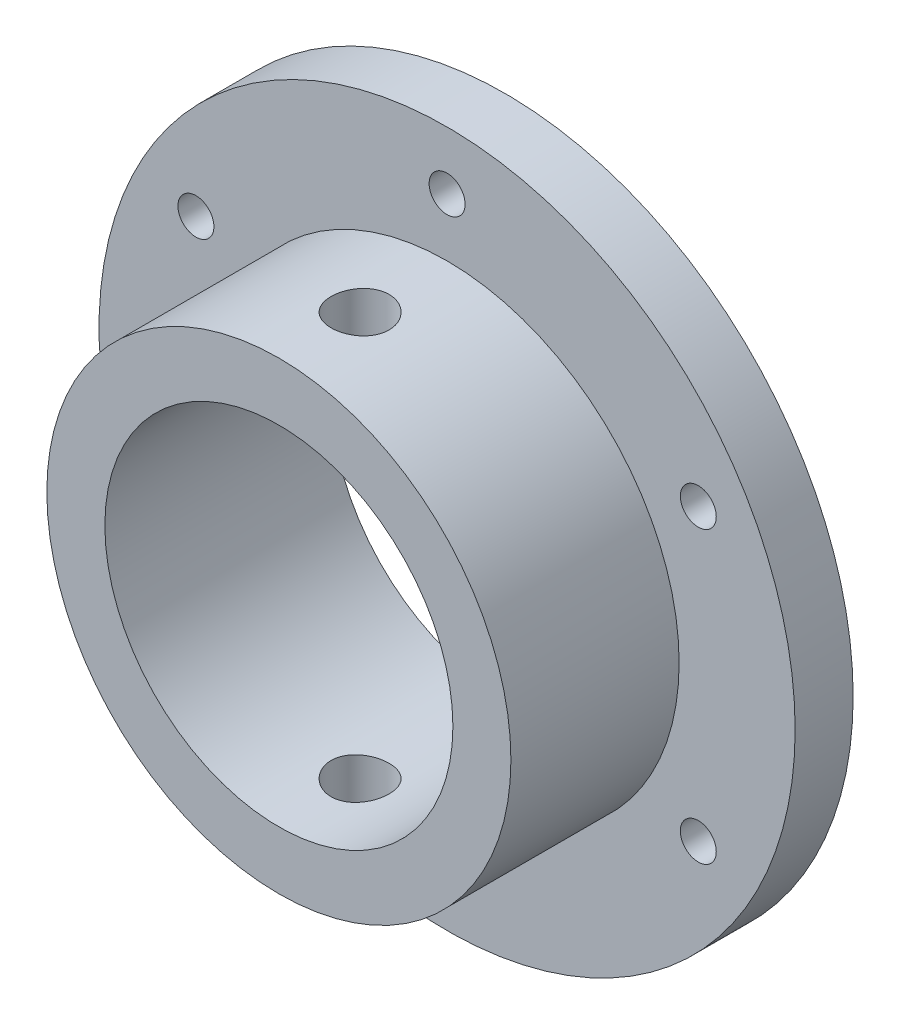
ISO-10303-21;
HEADER;
FILE_DESCRIPTION(('STEP AP214'),'2;1');
FILE_NAME('part.step','',(''),(''),'','','');
FILE_SCHEMA(('AUTOMOTIVE_DESIGN { 1 0 10303 214 1 1 1 1 }'));
ENDSEC;
DATA;
#1=APPLICATION_CONTEXT('core data for automotive mechanical design processes');
#2=APPLICATION_PROTOCOL_DEFINITION('international standard','automotive_design',2000,#1);
#3=PRODUCT_CONTEXT('',#1,'mechanical');
#4=PRODUCT('Part','Part','',(#3));
#5=PRODUCT_RELATED_PRODUCT_CATEGORY('part','',(#4));
#6=PRODUCT_DEFINITION_FORMATION('','',#4);
#7=PRODUCT_DEFINITION_CONTEXT('part definition',#1,'design');
#8=PRODUCT_DEFINITION('design','',#6,#7);
#9=PRODUCT_DEFINITION_SHAPE('','',#8);
#10=(LENGTH_UNIT() NAMED_UNIT(*) SI_UNIT(.MILLI.,.METRE.));
#11=(NAMED_UNIT(*) PLANE_ANGLE_UNIT() SI_UNIT($,.RADIAN.));
#12=(NAMED_UNIT(*) SI_UNIT($,.STERADIAN.) SOLID_ANGLE_UNIT());
#13=UNCERTAINTY_MEASURE_WITH_UNIT(LENGTH_MEASURE(1.E-05),#10,'distance_accuracy_value','');
#14=(GEOMETRIC_REPRESENTATION_CONTEXT(3) GLOBAL_UNCERTAINTY_ASSIGNED_CONTEXT((#13)) GLOBAL_UNIT_ASSIGNED_CONTEXT((#10,
#11,#12)) REPRESENTATION_CONTEXT('',''));
#15=CARTESIAN_POINT('',(0.,0.,0.));
#16=DIRECTION('',(0.,0.,1.));
#17=DIRECTION('',(1.,0.,0.));
#18=AXIS2_PLACEMENT_3D('',#15,#16,#17);
#19=CARTESIAN_POINT('',(0.,0.,5.));
#20=DIRECTION('',(0.,0.,-1.));
#21=DIRECTION('',(-1.,0.,0.));
#22=AXIS2_PLACEMENT_3D('',#19,#20,#21);
#23=CYLINDRICAL_SURFACE('',#22,30.);
#24=CARTESIAN_POINT('',(0.,0.,5.));
#25=DIRECTION('',(0.,0.,1.));
#26=DIRECTION('',(1.,0.,0.));
#27=AXIS2_PLACEMENT_3D('',#24,#25,#26);
#28=CIRCLE('',#27,30.);
#29=CARTESIAN_POINT('',(30.,0.,5.));
#30=VERTEX_POINT('',#29);
#31=EDGE_CURVE('E10',#30,#30,#28,.T.);
#32=ORIENTED_EDGE('',*,*,#31,.F.);
#33=EDGE_LOOP('',(#32));
#34=FACE_BOUND('',#33,.T.);
#35=CARTESIAN_POINT('',(0.,0.,0.));
#36=DIRECTION('',(0.,0.,1.));
#37=DIRECTION('',(1.,0.,0.));
#38=AXIS2_PLACEMENT_3D('',#35,#36,#37);
#39=CIRCLE('',#38,30.);
#40=CARTESIAN_POINT('',(30.,0.,0.));
#41=VERTEX_POINT('',#40);
#42=EDGE_CURVE('E38',#41,#41,#39,.T.);
#43=ORIENTED_EDGE('',*,*,#42,.T.);
#44=EDGE_LOOP('',(#43));
#45=FACE_BOUND('',#44,.T.);
#46=ADVANCED_FACE('F31',(#34,#45),#23,.T.);
#47=CARTESIAN_POINT('',(0.,0.,5.));
#48=DIRECTION('',(0.,0.,1.));
#49=DIRECTION('',(1.,0.,0.));
#50=AXIS2_PLACEMENT_3D('',#47,#48,#49);
#51=PLANE('',#50);
#52=CARTESIAN_POINT('',(0.,25.,5.));
#53=DIRECTION('',(0.,0.,1.));
#54=DIRECTION('',(1.,0.,0.));
#55=AXIS2_PLACEMENT_3D('',#52,#53,#54);
#56=CIRCLE('',#55,1.55);
#57=CARTESIAN_POINT('',(1.55,25.,5.));
#58=VERTEX_POINT('',#57);
#59=EDGE_CURVE('E200',#58,#58,#56,.T.);
#60=ORIENTED_EDGE('',*,*,#59,.F.);
#61=EDGE_LOOP('',(#60));
#62=FACE_BOUND('',#61,.T.);
#63=CARTESIAN_POINT('',(-21.6506350946103,12.4999999999988,5.));
#64=DIRECTION('',(0.,0.,1.));
#65=DIRECTION('',(1.,0.,0.));
#66=AXIS2_PLACEMENT_3D('',#63,#64,#65);
#67=CIRCLE('',#66,1.55);
#68=CARTESIAN_POINT('',(-20.1006350946103,12.4999999999988,5.));
#69=VERTEX_POINT('',#68);
#70=EDGE_CURVE('E224',#69,#69,#67,.T.);
#71=ORIENTED_EDGE('',*,*,#70,.F.);
#72=EDGE_LOOP('',(#71));
#73=FACE_BOUND('',#72,.T.);
#74=CARTESIAN_POINT('',(-21.6506350946088,-12.5000000000012,5.));
#75=DIRECTION('',(0.,0.,1.));
#76=DIRECTION('',(1.,0.,0.));
#77=AXIS2_PLACEMENT_3D('',#74,#75,#76);
#78=CIRCLE('',#77,1.55);
#79=CARTESIAN_POINT('',(-20.1006350946088,-12.5000000000012,5.));
#80=VERTEX_POINT('',#79);
#81=EDGE_CURVE('E91',#80,#80,#78,.T.);
#82=ORIENTED_EDGE('',*,*,#81,.F.);
#83=EDGE_LOOP('',(#82));
#84=FACE_BOUND('',#83,.T.);
#85=CARTESIAN_POINT('',(2.8329860920468E-12,-25.,5.));
#86=DIRECTION('',(0.,0.,1.));
#87=DIRECTION('',(1.,0.,0.));
#88=AXIS2_PLACEMENT_3D('',#85,#86,#87);
#89=CIRCLE('',#88,1.55);
#90=CARTESIAN_POINT('',(1.55000000000283,-25.,5.));
#91=VERTEX_POINT('',#90);
#92=EDGE_CURVE('E228',#91,#91,#89,.T.);
#93=ORIENTED_EDGE('',*,*,#92,.F.);
#94=EDGE_LOOP('',(#93));
#95=FACE_BOUND('',#94,.T.);
#96=CARTESIAN_POINT('',(21.6506350946131,-12.4999999999988,5.));
#97=DIRECTION('',(0.,0.,1.));
#98=DIRECTION('',(1.,0.,0.));
#99=AXIS2_PLACEMENT_3D('',#96,#97,#98);
#100=CIRCLE('',#99,1.55);
#101=CARTESIAN_POINT('',(23.2006350946131,-12.4999999999988,5.));
#102=VERTEX_POINT('',#101);
#103=EDGE_CURVE('E221',#102,#102,#100,.T.);
#104=ORIENTED_EDGE('',*,*,#103,.F.);
#105=EDGE_LOOP('',(#104));
#106=FACE_BOUND('',#105,.T.);
#107=CARTESIAN_POINT('',(21.6506350946117,12.5000000000012,5.));
#108=DIRECTION('',(0.,0.,1.));
#109=DIRECTION('',(1.,0.,0.));
#110=AXIS2_PLACEMENT_3D('',#107,#108,#109);
#111=CIRCLE('',#110,1.55);
#112=CARTESIAN_POINT('',(23.2006350946117,12.5000000000012,5.));
#113=VERTEX_POINT('',#112);
#114=EDGE_CURVE('E218',#113,#113,#111,.T.);
#115=ORIENTED_EDGE('',*,*,#114,.F.);
#116=EDGE_LOOP('',(#115));
#117=FACE_BOUND('',#116,.T.);
#118=CARTESIAN_POINT('',(0.,0.,5.));
#119=DIRECTION('',(0.,0.,1.));
#120=DIRECTION('',(1.,0.,0.));
#121=AXIS2_PLACEMENT_3D('',#118,#119,#120);
#122=CIRCLE('',#121,20.);
#123=CARTESIAN_POINT('',(20.,0.,5.));
#124=VERTEX_POINT('',#123);
#125=EDGE_CURVE('E46',#124,#124,#122,.T.);
#126=ORIENTED_EDGE('',*,*,#125,.F.);
#127=EDGE_LOOP('',(#126));
#128=FACE_BOUND('',#127,.T.);
#129=ORIENTED_EDGE('',*,*,#31,.T.);
#130=EDGE_LOOP('',(#129));
#131=FACE_BOUND('',#130,.T.);
#132=ADVANCED_FACE('F103',(#62,#73,#84,#95,#106,#117,#128,#131),#51,.T.);
#133=CARTESIAN_POINT('',(0.,0.,0.));
#134=DIRECTION('',(0.,0.,1.));
#135=DIRECTION('',(1.,0.,0.));
#136=AXIS2_PLACEMENT_3D('',#133,#134,#135);
#137=PLANE('',#136);
#138=CARTESIAN_POINT('',(0.,25.,0.));
#139=DIRECTION('',(0.,0.,1.));
#140=DIRECTION('',(1.,0.,0.));
#141=AXIS2_PLACEMENT_3D('',#138,#139,#140);
#142=CIRCLE('',#141,1.55);
#143=CARTESIAN_POINT('',(1.55,25.,0.));
#144=VERTEX_POINT('',#143);
#145=EDGE_CURVE('E34',#144,#144,#142,.T.);
#146=ORIENTED_EDGE('',*,*,#145,.T.);
#147=EDGE_LOOP('',(#146));
#148=FACE_BOUND('',#147,.T.);
#149=CARTESIAN_POINT('',(-21.6506350946103,12.4999999999988,0.));
#150=DIRECTION('',(0.,0.,1.));
#151=DIRECTION('',(1.,0.,0.));
#152=AXIS2_PLACEMENT_3D('',#149,#150,#151);
#153=CIRCLE('',#152,1.55);
#154=CARTESIAN_POINT('',(-20.1006350946103,12.4999999999988,0.));
#155=VERTEX_POINT('',#154);
#156=EDGE_CURVE('E202',#155,#155,#153,.T.);
#157=ORIENTED_EDGE('',*,*,#156,.T.);
#158=EDGE_LOOP('',(#157));
#159=FACE_BOUND('',#158,.T.);
#160=CARTESIAN_POINT('',(-21.6506350946088,-12.5000000000012,0.));
#161=DIRECTION('',(0.,0.,1.));
#162=DIRECTION('',(1.,0.,0.));
#163=AXIS2_PLACEMENT_3D('',#160,#161,#162);
#164=CIRCLE('',#163,1.55);
#165=CARTESIAN_POINT('',(-20.1006350946088,-12.5000000000012,0.));
#166=VERTEX_POINT('',#165);
#167=EDGE_CURVE('E204',#166,#166,#164,.T.);
#168=ORIENTED_EDGE('',*,*,#167,.T.);
#169=EDGE_LOOP('',(#168));
#170=FACE_BOUND('',#169,.T.);
#171=CARTESIAN_POINT('',(2.8329860920468E-12,-25.,0.));
#172=DIRECTION('',(0.,0.,1.));
#173=DIRECTION('',(1.,0.,0.));
#174=AXIS2_PLACEMENT_3D('',#171,#172,#173);
#175=CIRCLE('',#174,1.55);
#176=CARTESIAN_POINT('',(1.55000000000283,-25.,0.));
#177=VERTEX_POINT('',#176);
#178=EDGE_CURVE('E207',#177,#177,#175,.T.);
#179=ORIENTED_EDGE('',*,*,#178,.T.);
#180=EDGE_LOOP('',(#179));
#181=FACE_BOUND('',#180,.T.);
#182=CARTESIAN_POINT('',(21.6506350946131,-12.4999999999988,0.));
#183=DIRECTION('',(0.,0.,1.));
#184=DIRECTION('',(1.,0.,0.));
#185=AXIS2_PLACEMENT_3D('',#182,#183,#184);
#186=CIRCLE('',#185,1.55);
#187=CARTESIAN_POINT('',(23.2006350946131,-12.4999999999988,0.));
#188=VERTEX_POINT('',#187);
#189=EDGE_CURVE('E212',#188,#188,#186,.T.);
#190=ORIENTED_EDGE('',*,*,#189,.T.);
#191=EDGE_LOOP('',(#190));
#192=FACE_BOUND('',#191,.T.);
#193=CARTESIAN_POINT('',(21.6506350946117,12.5000000000012,0.));
#194=DIRECTION('',(0.,0.,1.));
#195=DIRECTION('',(1.,0.,0.));
#196=AXIS2_PLACEMENT_3D('',#193,#194,#195);
#197=CIRCLE('',#196,1.55);
#198=CARTESIAN_POINT('',(23.2006350946117,12.5000000000012,0.));
#199=VERTEX_POINT('',#198);
#200=EDGE_CURVE('E214',#199,#199,#197,.T.);
#201=ORIENTED_EDGE('',*,*,#200,.T.);
#202=EDGE_LOOP('',(#201));
#203=FACE_BOUND('',#202,.T.);
#204=CARTESIAN_POINT('',(0.,0.,0.));
#205=DIRECTION('',(0.,0.,1.));
#206=DIRECTION('',(1.,0.,0.));
#207=AXIS2_PLACEMENT_3D('',#204,#205,#206);
#208=CIRCLE('',#207,15.);
#209=CARTESIAN_POINT('',(15.,0.,0.));
#210=VERTEX_POINT('',#209);
#211=EDGE_CURVE('E49',#210,#210,#208,.T.);
#212=ORIENTED_EDGE('',*,*,#211,.T.);
#213=EDGE_LOOP('',(#212));
#214=FACE_BOUND('',#213,.T.);
#215=ORIENTED_EDGE('',*,*,#42,.F.);
#216=EDGE_LOOP('',(#215));
#217=FACE_BOUND('',#216,.T.);
#218=ADVANCED_FACE('F106',(#148,#159,#170,#181,#192,#203,#214,#217),#137,.F.);
#219=CARTESIAN_POINT('',(0.,0.,19.5));
#220=DIRECTION('',(0.,0.,1.));
#221=DIRECTION('',(1.,0.,0.));
#222=AXIS2_PLACEMENT_3D('',#219,#220,#221);
#223=PLANE('',#222);
#224=CARTESIAN_POINT('',(0.,0.,19.5));
#225=DIRECTION('',(0.,0.,1.));
#226=DIRECTION('',(1.,0.,0.));
#227=AXIS2_PLACEMENT_3D('',#224,#225,#226);
#228=CIRCLE('',#227,20.);
#229=CARTESIAN_POINT('',(20.,0.,19.5));
#230=VERTEX_POINT('',#229);
#231=EDGE_CURVE('E43',#230,#230,#228,.T.);
#232=ORIENTED_EDGE('',*,*,#231,.T.);
#233=EDGE_LOOP('',(#232));
#234=FACE_BOUND('',#233,.T.);
#235=CARTESIAN_POINT('',(0.,0.,19.5));
#236=DIRECTION('',(0.,0.,1.));
#237=DIRECTION('',(1.,0.,0.));
#238=AXIS2_PLACEMENT_3D('',#235,#236,#237);
#239=CIRCLE('',#238,15.);
#240=CARTESIAN_POINT('',(15.,0.,19.5));
#241=VERTEX_POINT('',#240);
#242=EDGE_CURVE('E52',#241,#241,#239,.T.);
#243=ORIENTED_EDGE('',*,*,#242,.F.);
#244=EDGE_LOOP('',(#243));
#245=FACE_BOUND('',#244,.T.);
#246=ADVANCED_FACE('F101',(#234,#245),#223,.T.);
#247=CARTESIAN_POINT('',(0.,0.,19.5));
#248=DIRECTION('',(0.,0.,-1.));
#249=DIRECTION('',(-1.,0.,0.));
#250=AXIS2_PLACEMENT_3D('',#247,#248,#249);
#251=CYLINDRICAL_SURFACE('',#250,20.);
#252=CARTESIAN_POINT('',(0.,-20.,15.));
#253=CARTESIAN_POINT('',(0.139841095555761,-19.9999980489643,14.9999940590643));
#254=CARTESIAN_POINT('',(0.279769574302747,-19.998517845549,14.9882271208307));
#255=CARTESIAN_POINT('',(0.555732802089753,-19.9927554011136,14.9414722454292));
#256=CARTESIAN_POINT('',(0.691763330623745,-19.9884702344143,14.9064600620766));
#257=CARTESIAN_POINT('',(0.955895574813054,-19.9775806104441,14.8142623560859));
#258=CARTESIAN_POINT('',(1.08400256014614,-19.9709777145554,14.7570917581901));
#259=CARTESIAN_POINT('',(1.32877947489304,-19.956187008781,14.6222327160302));
#260=CARTESIAN_POINT('',(1.44545136155637,-19.9479994708412,14.5445477914693));
#261=CARTESIAN_POINT('',(1.66471281693132,-19.9309032130633,14.3704080501604));
#262=CARTESIAN_POINT('',(1.76723036493713,-19.9219911469242,14.2738628706538));
#263=CARTESIAN_POINT('',(1.95465279355749,-19.9044772600975,14.0649371764634));
#264=CARTESIAN_POINT('',(2.03955677639225,-19.8958754552427,13.9525558550868));
#265=CARTESIAN_POINT('',(2.18961016128394,-19.8799230561958,13.7146800224343));
#266=CARTESIAN_POINT('',(2.25469209594107,-19.8725767717791,13.5891426384321));
#267=CARTESIAN_POINT('',(2.36282307657512,-19.8600112845768,13.3288129480526));
#268=CARTESIAN_POINT('',(2.40587295806522,-19.8547920011314,13.194020992853));
#269=CARTESIAN_POINT('',(2.46849898002476,-19.8471033960361,12.9197558044132));
#270=CARTESIAN_POINT('',(2.4881967147317,-19.8446198343674,12.7803107422958));
#271=CARTESIAN_POINT('',(2.50393554955723,-19.8426402814279,12.5000737365282));
#272=CARTESIAN_POINT('',(2.49997760100242,-19.8431441700151,12.3592818472687));
#273=CARTESIAN_POINT('',(2.4686172364479,-19.8470695536975,12.0811951727512));
#274=CARTESIAN_POINT('',(2.4413487629847,-19.8504743796033,11.9438850137997));
#275=CARTESIAN_POINT('',(2.36435038318205,-19.8597919975763,11.675804978781));
#276=CARTESIAN_POINT('',(2.3146200217519,-19.8657048404572,11.545035235286));
#277=CARTESIAN_POINT('',(2.19396555991165,-19.8793911586465,11.2933320009783));
#278=CARTESIAN_POINT('',(2.12298325370764,-19.8871697321144,11.172426699751));
#279=CARTESIAN_POINT('',(1.96188146945692,-19.903707114306,10.9441933055868));
#280=CARTESIAN_POINT('',(1.87176111608078,-19.9124659678566,10.8368658340263));
#281=CARTESIAN_POINT('',(1.67419911075378,-19.9300510989042,10.6380572892773));
#282=CARTESIAN_POINT('',(1.56664200784001,-19.9388774238689,10.546690908234));
#283=CARTESIAN_POINT('',(1.33765716911392,-19.9555463255585,10.3832911199695));
#284=CARTESIAN_POINT('',(1.21622940131825,-19.9633889000151,10.311257757328));
#285=CARTESIAN_POINT('',(0.962861671363481,-19.9772115221858,10.1885686795361));
#286=CARTESIAN_POINT('',(0.830918195337717,-19.9831909440154,10.1379201461188));
#287=CARTESIAN_POINT('',(0.560307940431056,-19.9926078578006,10.0595295064767));
#288=CARTESIAN_POINT('',(0.421641476630667,-19.9960454687587,10.0317863278629));
#289=CARTESIAN_POINT('',(0.142513163913496,-19.9999759641076,10.0001425757394));
#290=CARTESIAN_POINT('',(0.00206949019860591,-20.0004883614264,9.99608400763593));
#291=CARTESIAN_POINT('',(-0.277496036497497,-19.9985633800543,10.0115077340559));
#292=CARTESIAN_POINT('',(-0.416617917564708,-19.9961260641821,10.0309895272516));
#293=CARTESIAN_POINT('',(-0.689124507721523,-19.9885876875669,10.0928097087744));
#294=CARTESIAN_POINT('',(-0.822526570424706,-19.9834954081387,10.1350727634026));
#295=CARTESIAN_POINT('',(-1.08034965485841,-19.971217231002,10.2411774519129));
#296=CARTESIAN_POINT('',(-1.20477037146532,-19.9640312622062,10.3050198184914));
#297=CARTESIAN_POINT('',(-1.44180452068743,-19.9483182291011,10.4528531375075));
#298=CARTESIAN_POINT('',(-1.55435375994382,-19.9397844404251,10.5369462898056));
#299=CARTESIAN_POINT('',(-1.76379698962632,-19.9223514232566,10.7227494975342));
#300=CARTESIAN_POINT('',(-1.86069035833686,-19.913452180269,10.824460252251));
#301=CARTESIAN_POINT('',(-2.03663195881802,-19.8962310546258,11.0433074167571));
#302=CARTESIAN_POINT('',(-2.11557546056793,-19.8879127472133,11.1605283463104));
#303=CARTESIAN_POINT('',(-2.25265288944351,-19.8728541103715,11.4066582448547));
#304=CARTESIAN_POINT('',(-2.31078723372837,-19.8661137493103,11.5355669794765));
#305=CARTESIAN_POINT('',(-2.40442657886654,-19.85499850393,11.8010753191476));
#306=CARTESIAN_POINT('',(-2.43999062745711,-19.8506174518479,11.937653830048));
#307=CARTESIAN_POINT('',(-2.48766999386785,-19.8446991590745,12.2149024837807));
#308=CARTESIAN_POINT('',(-2.49978640253576,-19.8431617860878,12.355572435959));
#309=CARTESIAN_POINT('',(-2.50020653608484,-19.8431087698246,12.6359689292047));
#310=CARTESIAN_POINT('',(-2.48867479769927,-19.8445722475195,12.7756952483319));
#311=CARTESIAN_POINT('',(-2.44247440484933,-19.850311145372,13.0512071293451));
#312=CARTESIAN_POINT('',(-2.40780574790577,-19.8545865658308,13.1869926908088));
#313=CARTESIAN_POINT('',(-2.31636707368966,-19.8654611577455,13.4507469567664));
#314=CARTESIAN_POINT('',(-2.25960498097093,-19.8720594959278,13.5787184450218));
#315=CARTESIAN_POINT('',(-2.12560690215031,-19.8868378324482,13.8233466540483));
#316=CARTESIAN_POINT('',(-2.04837065950959,-19.8950178506041,13.9400032330198));
#317=CARTESIAN_POINT('',(-1.87500633126584,-19.9121060475223,14.1595312253405));
#318=CARTESIAN_POINT('',(-1.77875562577496,-19.9210187208403,14.262305460955));
#319=CARTESIAN_POINT('',(-1.57035022696838,-19.938528315929,14.450306825168));
#320=CARTESIAN_POINT('',(-1.45819178914157,-19.9471251627559,14.5355298107743));
#321=CARTESIAN_POINT('',(-1.22066562085421,-19.9630705658675,14.6862853571053));
#322=CARTESIAN_POINT('',(-1.09524927959617,-19.970414250783,14.7517418058993));
#323=CARTESIAN_POINT('',(-0.835182902301279,-19.9829764907672,14.8605712429163));
#324=CARTESIAN_POINT('',(-0.700543080870235,-19.9881973536958,14.9039682263535));
#325=CARTESIAN_POINT('',(-0.471005771967924,-19.9946672032775,14.9570593381713));
#326=CARTESIAN_POINT('',(-0.37755566351692,-19.9966572589545,14.9731389419821));
#327=CARTESIAN_POINT('',(-0.189417063212434,-19.9993243132919,14.9946112456932));
#328=CARTESIAN_POINT('',(-0.0947285804960271,-20.0000013216347,15.0000040243993));
#329=CARTESIAN_POINT('',(0.,-20.,15.));
#330=B_SPLINE_CURVE_WITH_KNOTS('',3,(#252,#253,#254,#255,#256,#257,#258,#259,#260,#261,#262,
#263,#264,#265,#266,#267,#268,#269,#270,#271,#272,#273,#274,#275,#276,#277,#278,#279,#280,#281,
#282,#283,#284,#285,#286,#287,#288,#289,#290,#291,#292,#293,#294,#295,#296,#297,#298,#299,#300,
#301,#302,#303,#304,#305,#306,#307,#308,#309,#310,#311,#312,#313,#314,#315,#316,#317,#318,#319,
#320,#321,#322,#323,#324,#325,#326,#327,#328,#329),.UNSPECIFIED.,.T.,.F.,(4,2,2,2,2,2,2,2,2,2,2,
2,2,2,2,2,2,2,2,2,2,2,2,2,2,2,2,2,2,2,2,2,2,2,2,2,2,2,4),(0.,0.419177272776247,
0.838792460943427,1.25812550818177,1.67738665591073,2.09870813201843,2.52005107800011,
2.9428125031887,3.36555789496807,3.78609225286321,4.20660969884664,4.62472696441692,
5.04285270166242,5.46213426285534,5.88143500513639,6.30363478136417,6.72583553113114,
7.14817795731606,7.57050060903781,7.99000279391922,8.40949604501929,8.82761053893396,
9.24573923078948,9.66602402928422,10.0863255137509,10.5090197150757,10.9317054422154,
11.3532807428093,11.7748364301062,12.1934690120222,12.6121016387955,13.0305842470649,
13.4490720991226,13.8703523769183,14.2917319847001,14.7147140303685,15.1372349868403,
15.4211884318763,15.7051397830044),.UNSPECIFIED.);
#331=CARTESIAN_POINT('',(0.,-20.,15.));
#332=VERTEX_POINT('',#331);
#333=EDGE_CURVE('E53',#332,#332,#330,.T.);
#334=ORIENTED_EDGE('',*,*,#333,.T.);
#335=EDGE_LOOP('',(#334));
#336=FACE_BOUND('',#335,.T.);
#337=CARTESIAN_POINT('',(0.,20.,15.));
#338=CARTESIAN_POINT('',(-0.139841095555761,19.9999980489643,14.9999940590643));
#339=CARTESIAN_POINT('',(-0.279769574302747,19.998517845549,14.9882271208307));
#340=CARTESIAN_POINT('',(-0.555732802089752,19.9927554011136,14.9414722454292));
#341=CARTESIAN_POINT('',(-0.691763330623745,19.9884702344143,14.9064600620766));
#342=CARTESIAN_POINT('',(-0.955895574813054,19.9775806104441,14.8142623560859));
#343=CARTESIAN_POINT('',(-1.08400256014614,19.9709777145554,14.7570917581901));
#344=CARTESIAN_POINT('',(-1.32877947489304,19.956187008781,14.6222327160302));
#345=CARTESIAN_POINT('',(-1.44545136155637,19.9479994708412,14.5445477914693));
#346=CARTESIAN_POINT('',(-1.66471281693132,19.9309032130633,14.3704080501604));
#347=CARTESIAN_POINT('',(-1.76723036493713,19.9219911469242,14.2738628706538));
#348=CARTESIAN_POINT('',(-1.95465279355749,19.9044772600975,14.0649371764634));
#349=CARTESIAN_POINT('',(-2.03955677639225,19.8958754552427,13.9525558550868));
#350=CARTESIAN_POINT('',(-2.18961016128394,19.8799230561958,13.7146800224343));
#351=CARTESIAN_POINT('',(-2.25469209594107,19.8725767717791,13.5891426384321));
#352=CARTESIAN_POINT('',(-2.36282307657512,19.8600112845768,13.3288129480526));
#353=CARTESIAN_POINT('',(-2.40587295806522,19.8547920011314,13.194020992853));
#354=CARTESIAN_POINT('',(-2.46849898002476,19.8471033960361,12.9197558044132));
#355=CARTESIAN_POINT('',(-2.4881967147317,19.8446198343674,12.7803107422958));
#356=CARTESIAN_POINT('',(-2.50393554955723,19.8426402814279,12.5000737365282));
#357=CARTESIAN_POINT('',(-2.49997760100242,19.8431441700151,12.3592818472687));
#358=CARTESIAN_POINT('',(-2.4686172364479,19.8470695536975,12.0811951727512));
#359=CARTESIAN_POINT('',(-2.4413487629847,19.8504743796033,11.9438850137997));
#360=CARTESIAN_POINT('',(-2.36435038318205,19.8597919975763,11.675804978781));
#361=CARTESIAN_POINT('',(-2.3146200217519,19.8657048404572,11.545035235286));
#362=CARTESIAN_POINT('',(-2.19396555991165,19.8793911586465,11.2933320009783));
#363=CARTESIAN_POINT('',(-2.12298325370764,19.8871697321144,11.172426699751));
#364=CARTESIAN_POINT('',(-1.96188146945692,19.903707114306,10.9441933055868));
#365=CARTESIAN_POINT('',(-1.87176111608078,19.9124659678566,10.8368658340263));
#366=CARTESIAN_POINT('',(-1.67419911075378,19.9300510989042,10.6380572892773));
#367=CARTESIAN_POINT('',(-1.56664200784001,19.9388774238689,10.546690908234));
#368=CARTESIAN_POINT('',(-1.33765716911392,19.9555463255585,10.3832911199695));
#369=CARTESIAN_POINT('',(-1.21622940131825,19.9633889000151,10.311257757328));
#370=CARTESIAN_POINT('',(-0.96286167136348,19.9772115221858,10.1885686795361));
#371=CARTESIAN_POINT('',(-0.830918195337715,19.9831909440154,10.1379201461188));
#372=CARTESIAN_POINT('',(-0.560307940431055,19.9926078578006,10.0595295064767));
#373=CARTESIAN_POINT('',(-0.421641476630666,19.9960454687587,10.0317863278629));
#374=CARTESIAN_POINT('',(-0.142513163913496,19.9999759641076,10.0001425757394));
#375=CARTESIAN_POINT('',(-0.00206949019860588,20.0004883614264,9.99608400763593));
#376=CARTESIAN_POINT('',(0.277496036497497,19.9985633800543,10.0115077340559));
#377=CARTESIAN_POINT('',(0.416617917564708,19.9961260641821,10.0309895272516));
#378=CARTESIAN_POINT('',(0.689124507721523,19.9885876875669,10.0928097087744));
#379=CARTESIAN_POINT('',(0.822526570424706,19.9834954081387,10.1350727634026));
#380=CARTESIAN_POINT('',(1.08034965485841,19.971217231002,10.2411774519129));
#381=CARTESIAN_POINT('',(1.20477037146532,19.9640312622062,10.3050198184914));
#382=CARTESIAN_POINT('',(1.44180452068743,19.9483182291011,10.4528531375075));
#383=CARTESIAN_POINT('',(1.55435375994382,19.9397844404251,10.5369462898056));
#384=CARTESIAN_POINT('',(1.76379698962632,19.9223514232566,10.7227494975342));
#385=CARTESIAN_POINT('',(1.86069035833686,19.913452180269,10.824460252251));
#386=CARTESIAN_POINT('',(2.03663195881802,19.8962310546258,11.0433074167571));
#387=CARTESIAN_POINT('',(2.11557546056793,19.8879127472133,11.1605283463104));
#388=CARTESIAN_POINT('',(2.25265288944351,19.8728541103715,11.4066582448547));
#389=CARTESIAN_POINT('',(2.31078723372837,19.8661137493103,11.5355669794765));
#390=CARTESIAN_POINT('',(2.40442657886654,19.85499850393,11.8010753191476));
#391=CARTESIAN_POINT('',(2.43999062745711,19.8506174518479,11.937653830048));
#392=CARTESIAN_POINT('',(2.48766999386785,19.8446991590745,12.2149024837807));
#393=CARTESIAN_POINT('',(2.49978640253576,19.8431617860878,12.355572435959));
#394=CARTESIAN_POINT('',(2.50020653608484,19.8431087698246,12.6359689292047));
#395=CARTESIAN_POINT('',(2.48867479769927,19.8445722475195,12.7756952483319));
#396=CARTESIAN_POINT('',(2.44247440484933,19.850311145372,13.0512071293451));
#397=CARTESIAN_POINT('',(2.40780574790577,19.8545865658308,13.1869926908088));
#398=CARTESIAN_POINT('',(2.31636707368966,19.8654611577455,13.4507469567664));
#399=CARTESIAN_POINT('',(2.25960498097093,19.8720594959278,13.5787184450218));
#400=CARTESIAN_POINT('',(2.12560690215031,19.8868378324482,13.8233466540483));
#401=CARTESIAN_POINT('',(2.04837065950959,19.8950178506041,13.9400032330198));
#402=CARTESIAN_POINT('',(1.87500633126584,19.9121060475223,14.1595312253405));
#403=CARTESIAN_POINT('',(1.77875562577496,19.9210187208403,14.262305460955));
#404=CARTESIAN_POINT('',(1.57035022696838,19.938528315929,14.450306825168));
#405=CARTESIAN_POINT('',(1.45819178914157,19.9471251627559,14.5355298107743));
#406=CARTESIAN_POINT('',(1.22066562085421,19.9630705658675,14.6862853571053));
#407=CARTESIAN_POINT('',(1.09524927959617,19.970414250783,14.7517418058993));
#408=CARTESIAN_POINT('',(0.83518290230128,19.9829764907672,14.8605712429163));
#409=CARTESIAN_POINT('',(0.700543080870235,19.9881973536958,14.9039682263535));
#410=CARTESIAN_POINT('',(0.471005771967924,19.9946672032775,14.9570593381713));
#411=CARTESIAN_POINT('',(0.37755566351692,19.9966572589545,14.9731389419821));
#412=CARTESIAN_POINT('',(0.189417063212434,19.9993243132919,14.9946112456932));
#413=CARTESIAN_POINT('',(0.0947285804960271,20.0000013216347,15.0000040243993));
#414=CARTESIAN_POINT('',(0.,20.,15.));
#415=B_SPLINE_CURVE_WITH_KNOTS('',3,(#337,#338,#339,#340,#341,#342,#343,#344,#345,#346,#347,
#348,#349,#350,#351,#352,#353,#354,#355,#356,#357,#358,#359,#360,#361,#362,#363,#364,#365,#366,
#367,#368,#369,#370,#371,#372,#373,#374,#375,#376,#377,#378,#379,#380,#381,#382,#383,#384,#385,
#386,#387,#388,#389,#390,#391,#392,#393,#394,#395,#396,#397,#398,#399,#400,#401,#402,#403,#404,
#405,#406,#407,#408,#409,#410,#411,#412,#413,#414),.UNSPECIFIED.,.T.,.F.,(4,2,2,2,2,2,2,2,2,2,2,
2,2,2,2,2,2,2,2,2,2,2,2,2,2,2,2,2,2,2,2,2,2,2,2,2,2,2,4),(0.,0.419177272776247,
0.838792460943427,1.25812550818177,1.67738665591073,2.09870813201843,2.52005107800011,
2.9428125031887,3.36555789496807,3.78609225286321,4.20660969884664,4.62472696441692,
5.04285270166242,5.46213426285534,5.88143500513639,6.30363478136417,6.72583553113114,
7.14817795731606,7.57050060903781,7.99000279391922,8.40949604501929,8.82761053893396,
9.24573923078948,9.66602402928422,10.0863255137509,10.5090197150757,10.9317054422154,
11.3532807428093,11.7748364301062,12.1934690120222,12.6121016387955,13.0305842470649,
13.4490720991226,13.8703523769183,14.2917319847001,14.7147140303685,15.1372349868403,
15.4211884318763,15.7051397830044),.UNSPECIFIED.);
#416=CARTESIAN_POINT('',(0.,20.,15.));
#417=VERTEX_POINT('',#416);
#418=EDGE_CURVE('E84',#417,#417,#415,.T.);
#419=ORIENTED_EDGE('',*,*,#418,.T.);
#420=EDGE_LOOP('',(#419));
#421=FACE_BOUND('',#420,.T.);
#422=ORIENTED_EDGE('',*,*,#231,.F.);
#423=EDGE_LOOP('',(#422));
#424=FACE_BOUND('',#423,.T.);
#425=ORIENTED_EDGE('',*,*,#125,.T.);
#426=EDGE_LOOP('',(#425));
#427=FACE_BOUND('',#426,.T.);
#428=ADVANCED_FACE('F97',(#336,#421,#424,#427),#251,.T.);
#429=CARTESIAN_POINT('',(0.,0.,19.5));
#430=DIRECTION('',(0.,0.,-1.));
#431=DIRECTION('',(-1.,0.,0.));
#432=AXIS2_PLACEMENT_3D('',#429,#430,#431);
#433=CYLINDRICAL_SURFACE('',#432,15.);
#434=CARTESIAN_POINT('',(0.,-15.,15.));
#435=CARTESIAN_POINT('',(0.139390904958215,-14.9999976116882,14.9999944110522));
#436=CARTESIAN_POINT('',(0.278857881838821,-14.9980367791303,14.9883027250311));
#437=CARTESIAN_POINT('',(0.553880221673043,-14.9904034494139,14.9418643412347));
#438=CARTESIAN_POINT('',(0.689431867959247,-14.9847275392389,14.9070964430884));
#439=CARTESIAN_POINT('',(0.952604747212644,-14.9703006823645,14.8155845514072));
#440=CARTESIAN_POINT('',(1.0802323684319,-14.9615522515919,14.7588585343594));
#441=CARTESIAN_POINT('',(1.32414184197795,-14.9419422708207,14.6250877079476));
#442=CARTESIAN_POINT('',(1.44042498987859,-14.9310809625443,14.548045222517));
#443=CARTESIAN_POINT('',(1.65947261429168,-14.9083331745831,14.3750449161795));
#444=CARTESIAN_POINT('',(1.76211290353497,-14.8964387181486,14.2789308853639));
#445=CARTESIAN_POINT('',(1.94988849865993,-14.8730262687673,14.0708520315272));
#446=CARTESIAN_POINT('',(2.03502269939097,-14.8615082996267,13.9588862085434));
#447=CARTESIAN_POINT('',(2.18586712560513,-14.8400756575978,13.7214290338029));
#448=CARTESIAN_POINT('',(2.251454552861,-14.8301712909164,13.5958586631952));
#449=CARTESIAN_POINT('',(2.36055836541122,-14.8131978979467,13.3352904356994));
#450=CARTESIAN_POINT('',(2.40407624156561,-14.8061286801431,13.2002932163224));
#451=CARTESIAN_POINT('',(2.46741437778481,-14.7957053684276,12.9260197251435));
#452=CARTESIAN_POINT('',(2.4874490291354,-14.792317684857,12.7867942634986));
#453=CARTESIAN_POINT('',(2.50391672528988,-14.7895393893665,12.5069197231165));
#454=CARTESIAN_POINT('',(2.500351440389,-14.7901484945721,12.3662707458327));
#455=CARTESIAN_POINT('',(2.46989509839615,-14.7952642886355,12.0890721387245));
#456=CARTESIAN_POINT('',(2.44324488188977,-14.7997307331892,11.9524951964548));
#457=CARTESIAN_POINT('',(2.36775314040345,-14.8119949521101,11.6857786821709));
#458=CARTESIAN_POINT('',(2.31891085431974,-14.8197928407327,11.5556393311115));
#459=CARTESIAN_POINT('',(2.20017724609391,-14.837884793341,11.3047711765591));
#460=CARTESIAN_POINT('',(2.13018591387971,-14.8481906710733,11.1840905939188));
#461=CARTESIAN_POINT('',(1.97121201755743,-14.8701291841501,10.9560955994616));
#462=CARTESIAN_POINT('',(1.88222792065429,-14.8817619265429,10.8487822675451));
#463=CARTESIAN_POINT('',(1.68648221215905,-14.9052202787979,10.6491739141926));
#464=CARTESIAN_POINT('',(1.57951396387313,-14.9170464923165,10.5570814814599));
#465=CARTESIAN_POINT('',(1.35153524898165,-14.9394260139672,10.3921222373347));
#466=CARTESIAN_POINT('',(1.23052469190642,-14.9499793138975,10.3192555498168));
#467=CARTESIAN_POINT('',(0.977705916166711,-14.9686389289291,10.1947977728637));
#468=CARTESIAN_POINT('',(0.845888725564661,-14.9767431840745,10.1432245806687));
#469=CARTESIAN_POINT('',(0.575298345602731,-14.9895750301266,10.063005784754));
#470=CARTESIAN_POINT('',(0.436525739179468,-14.9943029035047,10.0343582630263));
#471=CARTESIAN_POINT('',(0.157709901301623,-14.9998112984269,10.0010786415389));
#472=CARTESIAN_POINT('',(0.0177007371510109,-15.0006375301278,9.99616842819439));
#473=CARTESIAN_POINT('',(-0.261139772889888,-14.9983747442117,10.0097613444281));
#474=CARTESIAN_POINT('',(-0.399971163892039,-14.9952858772412,10.0282635731337));
#475=CARTESIAN_POINT('',(-0.671656175546764,-14.985568269382,10.0879248493355));
#476=CARTESIAN_POINT('',(-0.80454086838538,-14.9789610480131,10.1289462083901));
#477=CARTESIAN_POINT('',(-1.06154688486044,-14.9629446445536,10.2323345181995));
#478=CARTESIAN_POINT('',(-1.18566771590972,-14.9535353051202,10.2947026676353));
#479=CARTESIAN_POINT('',(-1.42283068946896,-14.9328451630241,10.4396511246968));
#480=CARTESIAN_POINT('',(-1.53576525093715,-14.9215485588702,10.5224051561673));
#481=CARTESIAN_POINT('',(-1.74624358550269,-14.898384673919,10.7055373153851));
#482=CARTESIAN_POINT('',(-1.84378623969658,-14.8865173517155,10.8059167232767));
#483=CARTESIAN_POINT('',(-2.021742779658,-14.8634017523585,11.0226975480714));
#484=CARTESIAN_POINT('',(-2.10196876111372,-14.8521611613711,11.1392541655144));
#485=CARTESIAN_POINT('',(-2.24170231029499,-14.8317152977788,11.3843529691385));
#486=CARTESIAN_POINT('',(-2.30121053476982,-14.8225099606602,11.5128947752275));
#487=CARTESIAN_POINT('',(-2.39753833147315,-14.807234536977,11.7777897328121));
#488=CARTESIAN_POINT('',(-2.43445143254795,-14.8011515431106,11.9141080950305));
#489=CARTESIAN_POINT('',(-2.48483545377828,-14.7927771683526,12.1911201292218));
#490=CARTESIAN_POINT('',(-2.49830841194617,-14.7904854578272,12.3318134197321));
#491=CARTESIAN_POINT('',(-2.50137286604735,-14.7899673308401,12.6117051659624));
#492=CARTESIAN_POINT('',(-2.49126013612519,-14.7916905650565,12.7509003785753));
#493=CARTESIAN_POINT('',(-2.44807983895685,-14.7988978145373,13.0255792480508));
#494=CARTESIAN_POINT('',(-2.41501234611248,-14.8043818176121,13.1610629169419));
#495=CARTESIAN_POINT('',(-2.3269744895949,-14.8184735628172,13.4243584372926));
#496=CARTESIAN_POINT('',(-2.27202959060044,-14.8270776721967,13.552179010056));
#497=CARTESIAN_POINT('',(-2.14182700391591,-14.8464436892221,13.7968356691948));
#498=CARTESIAN_POINT('',(-2.06656830874856,-14.857205703884,13.9136712103721));
#499=CARTESIAN_POINT('',(-1.89681888437215,-14.8798345404562,14.1345355831078));
#500=CARTESIAN_POINT('',(-1.80211056359365,-14.891712955763,14.2383960167003));
#501=CARTESIAN_POINT('',(-1.59660903138023,-14.9151437236084,14.4288516044749));
#502=CARTESIAN_POINT('',(-1.48581211291264,-14.9266960002655,14.5154427686382));
#503=CARTESIAN_POINT('',(-1.25036916964028,-14.9482652964222,14.6694482681999));
#504=CARTESIAN_POINT('',(-1.12563278753282,-14.958271162531,14.736726039313));
#505=CARTESIAN_POINT('',(-0.866513069378981,-14.9755116760178,14.8492694846099));
#506=CARTESIAN_POINT('',(-0.732139494830009,-14.9827490817748,14.8945570810797));
#507=CARTESIAN_POINT('',(-0.4977033100454,-14.9920579083296,14.9520052741267));
#508=CARTESIAN_POINT('',(-0.399058830298447,-14.9950202727336,14.969974469616));
#509=CARTESIAN_POINT('',(-0.200289310319809,-14.9989921598612,14.9939737378448));
#510=CARTESIAN_POINT('',(-0.100164295608494,-15.0000017162064,15.0000040161374));
#511=CARTESIAN_POINT('',(0.,-15.,15.));
#512=B_SPLINE_CURVE_WITH_KNOTS('',3,(#434,#435,#436,#437,#438,#439,#440,#441,#442,#443,#444,
#445,#446,#447,#448,#449,#450,#451,#452,#453,#454,#455,#456,#457,#458,#459,#460,#461,#462,#463,
#464,#465,#466,#467,#468,#469,#470,#471,#472,#473,#474,#475,#476,#477,#478,#479,#480,#481,#482,
#483,#484,#485,#486,#487,#488,#489,#490,#491,#492,#493,#494,#495,#496,#497,#498,#499,#500,#501,
#502,#503,#504,#505,#506,#507,#508,#509,#510,#511),.UNSPECIFIED.,.T.,.F.,(4,2,2,2,2,2,2,2,2,2,2,
2,2,2,2,2,2,2,2,2,2,2,2,2,2,2,2,2,2,2,2,2,2,2,2,2,2,2,4),(0.,0.41780658493851,0.835997545695421,
1.25384686702527,1.67164841267479,2.09302491062332,2.51442800169857,2.9384252082384,
3.36239376876181,3.78246077103424,4.20249804320887,4.61820521760409,5.03392665025381,
5.45164556632558,5.86939820680574,6.29232769911327,6.71525991635848,7.13854688915904,
7.56179844521149,7.98007883491398,8.3983431303586,8.81407807006416,9.22983635826067,
9.64926825627024,10.0687306305428,10.4925382200762,10.9163323737594,11.3383602234177,
11.7603513778662,12.177079095227,12.5938054618813,13.0100481822622,13.4263115502934,
13.8475138419339,14.2688133387897,14.693022316072,15.1168075213007,15.4170424816402,
15.7172722727697),.UNSPECIFIED.);
#513=CARTESIAN_POINT('',(0.,-15.,15.));
#514=VERTEX_POINT('',#513);
#515=EDGE_CURVE('E62',#514,#514,#512,.T.);
#516=ORIENTED_EDGE('',*,*,#515,.F.);
#517=EDGE_LOOP('',(#516));
#518=FACE_BOUND('',#517,.T.);
#519=CARTESIAN_POINT('',(0.,15.,15.));
#520=CARTESIAN_POINT('',(-0.139390904958215,14.9999976116882,14.9999944110522));
#521=CARTESIAN_POINT('',(-0.278857881838821,14.9980367791303,14.9883027250311));
#522=CARTESIAN_POINT('',(-0.553880221673043,14.9904034494139,14.9418643412347));
#523=CARTESIAN_POINT('',(-0.689431867959247,14.9847275392389,14.9070964430884));
#524=CARTESIAN_POINT('',(-0.952604747212644,14.9703006823645,14.8155845514072));
#525=CARTESIAN_POINT('',(-1.0802323684319,14.9615522515919,14.7588585343594));
#526=CARTESIAN_POINT('',(-1.32414184197794,14.9419422708207,14.6250877079476));
#527=CARTESIAN_POINT('',(-1.44042498987859,14.9310809625443,14.548045222517));
#528=CARTESIAN_POINT('',(-1.65947261429168,14.9083331745831,14.3750449161795));
#529=CARTESIAN_POINT('',(-1.76211290353497,14.8964387181486,14.2789308853639));
#530=CARTESIAN_POINT('',(-1.94988849865993,14.8730262687673,14.0708520315272));
#531=CARTESIAN_POINT('',(-2.03502269939097,14.8615082996267,13.9588862085434));
#532=CARTESIAN_POINT('',(-2.18586712560513,14.8400756575978,13.7214290338029));
#533=CARTESIAN_POINT('',(-2.251454552861,14.8301712909164,13.5958586631952));
#534=CARTESIAN_POINT('',(-2.36055836541122,14.8131978979467,13.3352904356994));
#535=CARTESIAN_POINT('',(-2.40407624156561,14.8061286801431,13.2002932163224));
#536=CARTESIAN_POINT('',(-2.46741437778481,14.7957053684276,12.9260197251435));
#537=CARTESIAN_POINT('',(-2.4874490291354,14.792317684857,12.7867942634986));
#538=CARTESIAN_POINT('',(-2.50391672528988,14.7895393893665,12.5069197231165));
#539=CARTESIAN_POINT('',(-2.500351440389,14.7901484945721,12.3662707458327));
#540=CARTESIAN_POINT('',(-2.46989509839615,14.7952642886355,12.0890721387245));
#541=CARTESIAN_POINT('',(-2.44324488188977,14.7997307331892,11.9524951964548));
#542=CARTESIAN_POINT('',(-2.36775314040345,14.8119949521101,11.6857786821709));
#543=CARTESIAN_POINT('',(-2.31891085431974,14.8197928407327,11.5556393311115));
#544=CARTESIAN_POINT('',(-2.20017724609391,14.837884793341,11.3047711765591));
#545=CARTESIAN_POINT('',(-2.13018591387971,14.8481906710733,11.1840905939188));
#546=CARTESIAN_POINT('',(-1.97121201755743,14.8701291841501,10.9560955994616));
#547=CARTESIAN_POINT('',(-1.88222792065429,14.8817619265429,10.8487822675451));
#548=CARTESIAN_POINT('',(-1.68648221215906,14.9052202787979,10.6491739141927));
#549=CARTESIAN_POINT('',(-1.57951396387313,14.9170464923165,10.5570814814599));
#550=CARTESIAN_POINT('',(-1.35153524898165,14.9394260139672,10.3921222373347));
#551=CARTESIAN_POINT('',(-1.23052469190642,14.9499793138975,10.3192555498168));
#552=CARTESIAN_POINT('',(-0.977705916166712,14.9686389289291,10.1947977728637));
#553=CARTESIAN_POINT('',(-0.845888725564662,14.9767431840745,10.1432245806687));
#554=CARTESIAN_POINT('',(-0.575298345602732,14.9895750301266,10.063005784754));
#555=CARTESIAN_POINT('',(-0.436525739179469,14.9943029035047,10.0343582630263));
#556=CARTESIAN_POINT('',(-0.157709901301624,14.9998112984269,10.0010786415389));
#557=CARTESIAN_POINT('',(-0.0177007371510122,15.0006375301278,9.99616842819439));
#558=CARTESIAN_POINT('',(0.261139772889886,14.9983747442117,10.0097613444281));
#559=CARTESIAN_POINT('',(0.399971163892038,14.9952858772412,10.0282635731337));
#560=CARTESIAN_POINT('',(0.671656175546763,14.985568269382,10.0879248493355));
#561=CARTESIAN_POINT('',(0.804540868385378,14.9789610480131,10.1289462083901));
#562=CARTESIAN_POINT('',(1.06154688486044,14.9629446445536,10.2323345181995));
#563=CARTESIAN_POINT('',(1.18566771590972,14.9535353051202,10.2947026676353));
#564=CARTESIAN_POINT('',(1.42283068946896,14.9328451630241,10.4396511246968));
#565=CARTESIAN_POINT('',(1.53576525093715,14.9215485588702,10.5224051561673));
#566=CARTESIAN_POINT('',(1.74624358550269,14.898384673919,10.7055373153851));
#567=CARTESIAN_POINT('',(1.84378623969658,14.8865173517155,10.8059167232767));
#568=CARTESIAN_POINT('',(2.021742779658,14.8634017523585,11.0226975480714));
#569=CARTESIAN_POINT('',(2.10196876111372,14.8521611613711,11.1392541655144));
#570=CARTESIAN_POINT('',(2.24170231029499,14.8317152977788,11.3843529691385));
#571=CARTESIAN_POINT('',(2.30121053476982,14.8225099606602,11.5128947752275));
#572=CARTESIAN_POINT('',(2.39753833147315,14.807234536977,11.7777897328121));
#573=CARTESIAN_POINT('',(2.43445143254795,14.8011515431106,11.9141080950305));
#574=CARTESIAN_POINT('',(2.48483545377828,14.7927771683526,12.1911201292218));
#575=CARTESIAN_POINT('',(2.49830841194617,14.7904854578272,12.3318134197321));
#576=CARTESIAN_POINT('',(2.50137286604735,14.7899673308401,12.6117051659624));
#577=CARTESIAN_POINT('',(2.49126013612519,14.7916905650565,12.7509003785753));
#578=CARTESIAN_POINT('',(2.44807983895685,14.7988978145373,13.0255792480508));
#579=CARTESIAN_POINT('',(2.41501234611248,14.8043818176121,13.1610629169419));
#580=CARTESIAN_POINT('',(2.3269744895949,14.8184735628172,13.4243584372926));
#581=CARTESIAN_POINT('',(2.27202959060044,14.8270776721967,13.552179010056));
#582=CARTESIAN_POINT('',(2.14182700391591,14.8464436892221,13.7968356691948));
#583=CARTESIAN_POINT('',(2.06656830874856,14.857205703884,13.9136712103721));
#584=CARTESIAN_POINT('',(1.89681888437216,14.8798345404562,14.1345355831078));
#585=CARTESIAN_POINT('',(1.80211056359365,14.891712955763,14.2383960167003));
#586=CARTESIAN_POINT('',(1.59660903138023,14.9151437236084,14.4288516044749));
#587=CARTESIAN_POINT('',(1.48581211291264,14.9266960002655,14.5154427686382));
#588=CARTESIAN_POINT('',(1.25036916964028,14.9482652964222,14.6694482681999));
#589=CARTESIAN_POINT('',(1.12563278753282,14.958271162531,14.736726039313));
#590=CARTESIAN_POINT('',(0.866513069378981,14.9755116760178,14.8492694846099));
#591=CARTESIAN_POINT('',(0.732139494830011,14.9827490817748,14.8945570810797));
#592=CARTESIAN_POINT('',(0.497703310045402,14.9920579083296,14.9520052741267));
#593=CARTESIAN_POINT('',(0.399058830298448,14.9950202727336,14.969974469616));
#594=CARTESIAN_POINT('',(0.200289310319809,14.9989921598612,14.9939737378448));
#595=CARTESIAN_POINT('',(0.100164295608494,15.0000017162064,15.0000040161374));
#596=CARTESIAN_POINT('',(0.,15.,15.));
#597=B_SPLINE_CURVE_WITH_KNOTS('',3,(#519,#520,#521,#522,#523,#524,#525,#526,#527,#528,#529,
#530,#531,#532,#533,#534,#535,#536,#537,#538,#539,#540,#541,#542,#543,#544,#545,#546,#547,#548,
#549,#550,#551,#552,#553,#554,#555,#556,#557,#558,#559,#560,#561,#562,#563,#564,#565,#566,#567,
#568,#569,#570,#571,#572,#573,#574,#575,#576,#577,#578,#579,#580,#581,#582,#583,#584,#585,#586,
#587,#588,#589,#590,#591,#592,#593,#594,#595,#596),.UNSPECIFIED.,.T.,.F.,(4,2,2,2,2,2,2,2,2,2,2,
2,2,2,2,2,2,2,2,2,2,2,2,2,2,2,2,2,2,2,2,2,2,2,2,2,2,2,4),(0.,0.417806584938509,0.83599754569542,
1.25384686702527,1.67164841267479,2.09302491062332,2.51442800169857,2.9384252082384,
3.36239376876181,3.78246077103424,4.20249804320887,4.61820521760409,5.03392665025381,
5.45164556632558,5.86939820680574,6.29232769911327,6.71525991635848,7.13854688915904,
7.56179844521149,7.98007883491397,8.3983431303586,8.81407807006416,9.22983635826067,
9.64926825627024,10.0687306305428,10.4925382200762,10.9163323737594,11.3383602234177,
11.7603513778662,12.177079095227,12.5938054618813,13.0100481822622,13.4263115502934,
13.8475138419339,14.2688133387897,14.693022316072,15.1168075213007,15.4170424816402,
15.7172722727697),.UNSPECIFIED.);
#598=CARTESIAN_POINT('',(0.,15.,15.));
#599=VERTEX_POINT('',#598);
#600=EDGE_CURVE('E54',#599,#599,#597,.T.);
#601=ORIENTED_EDGE('',*,*,#600,.F.);
#602=EDGE_LOOP('',(#601));
#603=FACE_BOUND('',#602,.T.);
#604=ORIENTED_EDGE('',*,*,#242,.T.);
#605=EDGE_LOOP('',(#604));
#606=FACE_BOUND('',#605,.T.);
#607=ORIENTED_EDGE('',*,*,#211,.F.);
#608=EDGE_LOOP('',(#607));
#609=FACE_BOUND('',#608,.T.);
#610=ADVANCED_FACE('F67',(#518,#603,#606,#609),#433,.F.);
#611=CARTESIAN_POINT('',(0.,-30.,12.5));
#612=DIRECTION('',(0.,1.,0.));
#613=DIRECTION('',(0.,0.,1.));
#614=AXIS2_PLACEMENT_3D('',#611,#612,#613);
#615=CYLINDRICAL_SURFACE('',#614,2.5);
#616=ORIENTED_EDGE('',*,*,#600,.T.);
#617=EDGE_LOOP('',(#616));
#618=FACE_BOUND('',#617,.T.);
#619=ORIENTED_EDGE('',*,*,#418,.F.);
#620=EDGE_LOOP('',(#619));
#621=FACE_BOUND('',#620,.T.);
#622=ADVANCED_FACE('F75',(#618,#621),#615,.F.);
#623=ORIENTED_EDGE('',*,*,#515,.T.);
#624=EDGE_LOOP('',(#623));
#625=FACE_BOUND('',#624,.T.);
#626=ORIENTED_EDGE('',*,*,#333,.F.);
#627=EDGE_LOOP('',(#626));
#628=FACE_BOUND('',#627,.T.);
#629=ADVANCED_FACE('F70',(#625,#628),#615,.F.);
#630=CARTESIAN_POINT('',(21.6506350946117,12.5000000000012,-5.));
#631=DIRECTION('',(0.,0.,1.));
#632=DIRECTION('',(1.,0.,0.));
#633=AXIS2_PLACEMENT_3D('',#630,#631,#632);
#634=CYLINDRICAL_SURFACE('',#633,1.55);
#635=ORIENTED_EDGE('',*,*,#114,.T.);
#636=EDGE_LOOP('',(#635));
#637=FACE_BOUND('',#636,.T.);
#638=ORIENTED_EDGE('',*,*,#200,.F.);
#639=EDGE_LOOP('',(#638));
#640=FACE_BOUND('',#639,.T.);
#641=ADVANCED_FACE('F74',(#637,#640),#634,.F.);
#642=CARTESIAN_POINT('',(21.6506350946131,-12.4999999999988,-5.));
#643=DIRECTION('',(0.,0.,1.));
#644=DIRECTION('',(1.,0.,0.));
#645=AXIS2_PLACEMENT_3D('',#642,#643,#644);
#646=CYLINDRICAL_SURFACE('',#645,1.55);
#647=ORIENTED_EDGE('',*,*,#103,.T.);
#648=EDGE_LOOP('',(#647));
#649=FACE_BOUND('',#648,.T.);
#650=ORIENTED_EDGE('',*,*,#189,.F.);
#651=EDGE_LOOP('',(#650));
#652=FACE_BOUND('',#651,.T.);
#653=ADVANCED_FACE('F146',(#649,#652),#646,.F.);
#654=CARTESIAN_POINT('',(2.8329860920468E-12,-25.,-5.));
#655=DIRECTION('',(0.,0.,1.));
#656=DIRECTION('',(1.,0.,0.));
#657=AXIS2_PLACEMENT_3D('',#654,#655,#656);
#658=CYLINDRICAL_SURFACE('',#657,1.55);
#659=ORIENTED_EDGE('',*,*,#92,.T.);
#660=EDGE_LOOP('',(#659));
#661=FACE_BOUND('',#660,.T.);
#662=ORIENTED_EDGE('',*,*,#178,.F.);
#663=EDGE_LOOP('',(#662));
#664=FACE_BOUND('',#663,.T.);
#665=ADVANCED_FACE('F156',(#661,#664),#658,.F.);
#666=CARTESIAN_POINT('',(-21.6506350946088,-12.5000000000012,-5.));
#667=DIRECTION('',(0.,0.,1.));
#668=DIRECTION('',(1.,0.,0.));
#669=AXIS2_PLACEMENT_3D('',#666,#667,#668);
#670=CYLINDRICAL_SURFACE('',#669,1.55);
#671=ORIENTED_EDGE('',*,*,#81,.T.);
#672=EDGE_LOOP('',(#671));
#673=FACE_BOUND('',#672,.T.);
#674=ORIENTED_EDGE('',*,*,#167,.F.);
#675=EDGE_LOOP('',(#674));
#676=FACE_BOUND('',#675,.T.);
#677=ADVANCED_FACE('F77',(#673,#676),#670,.F.);
#678=CARTESIAN_POINT('',(-21.6506350946103,12.4999999999988,-5.));
#679=DIRECTION('',(0.,0.,1.));
#680=DIRECTION('',(1.,0.,0.));
#681=AXIS2_PLACEMENT_3D('',#678,#679,#680);
#682=CYLINDRICAL_SURFACE('',#681,1.55);
#683=ORIENTED_EDGE('',*,*,#70,.T.);
#684=EDGE_LOOP('',(#683));
#685=FACE_BOUND('',#684,.T.);
#686=ORIENTED_EDGE('',*,*,#156,.F.);
#687=EDGE_LOOP('',(#686));
#688=FACE_BOUND('',#687,.T.);
#689=ADVANCED_FACE('F174',(#685,#688),#682,.F.);
#690=CARTESIAN_POINT('',(0.,25.,-5.));
#691=DIRECTION('',(0.,0.,1.));
#692=DIRECTION('',(1.,0.,0.));
#693=AXIS2_PLACEMENT_3D('',#690,#691,#692);
#694=CYLINDRICAL_SURFACE('',#693,1.55);
#695=ORIENTED_EDGE('',*,*,#59,.T.);
#696=EDGE_LOOP('',(#695));
#697=FACE_BOUND('',#696,.T.);
#698=ORIENTED_EDGE('',*,*,#145,.F.);
#699=EDGE_LOOP('',(#698));
#700=FACE_BOUND('',#699,.T.);
#701=ADVANCED_FACE('F183',(#697,#700),#694,.F.);
#702=CLOSED_SHELL('',(#46,#132,#218,#246,#428,#610,#622,#629,#641,#653,#665,#677,#689,#701));
#703=MANIFOLD_SOLID_BREP('B2',#702);
#704=ADVANCED_BREP_SHAPE_REPRESENTATION('',(#18,#703),#14);
#705=SHAPE_DEFINITION_REPRESENTATION(#9,#704);
ENDSEC;
END-ISO-10303-21;
